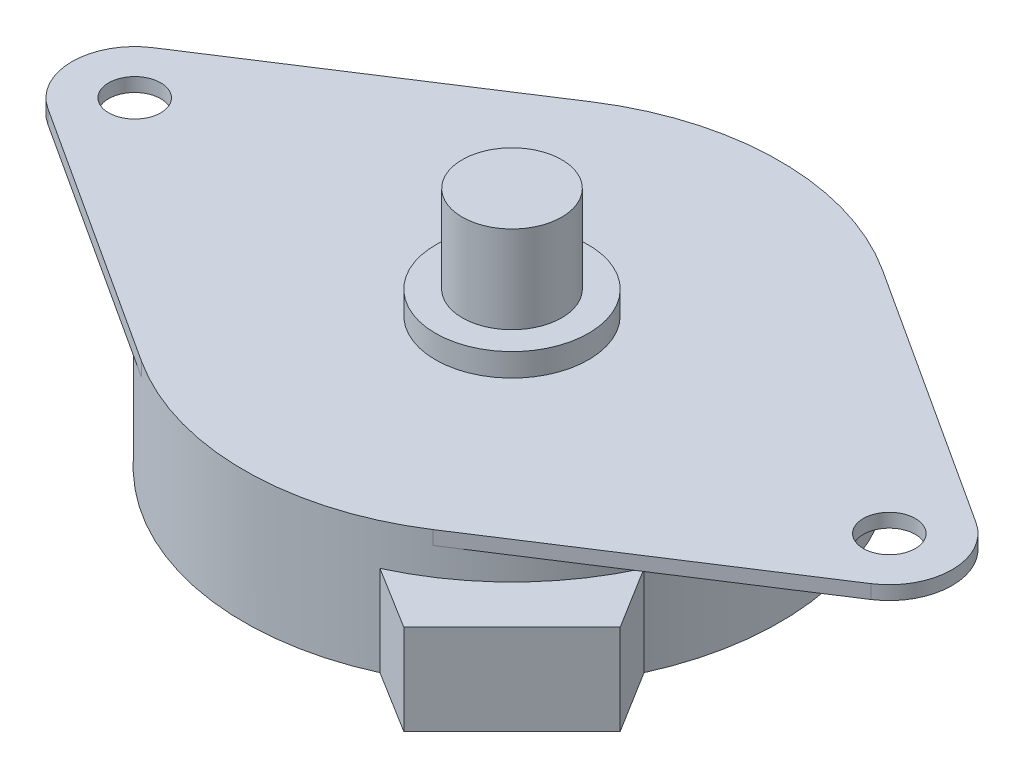
ISO-10303-21;
HEADER;
FILE_DESCRIPTION(('STEP AP214'),'2;1');
FILE_NAME('part.step','',(''),(''),'','','');
FILE_SCHEMA(('AUTOMOTIVE_DESIGN { 1 0 10303 214 1 1 1 1 }'));
ENDSEC;
DATA;
#1=APPLICATION_CONTEXT('core data for automotive mechanical design processes');
#2=APPLICATION_PROTOCOL_DEFINITION('international standard','automotive_design',2000,#1);
#3=PRODUCT_CONTEXT('',#1,'mechanical');
#4=PRODUCT('Part','Part','',(#3));
#5=PRODUCT_RELATED_PRODUCT_CATEGORY('part','',(#4));
#6=PRODUCT_DEFINITION_FORMATION('','',#4);
#7=PRODUCT_DEFINITION_CONTEXT('part definition',#1,'design');
#8=PRODUCT_DEFINITION('design','',#6,#7);
#9=PRODUCT_DEFINITION_SHAPE('','',#8);
#10=(LENGTH_UNIT() NAMED_UNIT(*) SI_UNIT(.MILLI.,.METRE.));
#11=(NAMED_UNIT(*) PLANE_ANGLE_UNIT() SI_UNIT($,.RADIAN.));
#12=(NAMED_UNIT(*) SI_UNIT($,.STERADIAN.) SOLID_ANGLE_UNIT());
#13=UNCERTAINTY_MEASURE_WITH_UNIT(LENGTH_MEASURE(1.E-05),#10,'distance_accuracy_value','');
#14=(GEOMETRIC_REPRESENTATION_CONTEXT(3) GLOBAL_UNCERTAINTY_ASSIGNED_CONTEXT((#13)) GLOBAL_UNIT_ASSIGNED_CONTEXT((#10,
#11,#12)) REPRESENTATION_CONTEXT('',''));
#15=CARTESIAN_POINT('',(0.,0.,0.));
#16=DIRECTION('',(0.,0.,1.));
#17=DIRECTION('',(1.,0.,0.));
#18=AXIS2_PLACEMENT_3D('',#15,#16,#17);
#19=CARTESIAN_POINT('',(0.,2.4,0.));
#20=DIRECTION('',(0.,1.,0.));
#21=DIRECTION('',(0.,0.,1.));
#22=AXIS2_PLACEMENT_3D('',#19,#20,#21);
#23=PLANE('',#22);
#24=CARTESIAN_POINT('',(0.,2.4,0.));
#25=DIRECTION('',(0.,1.,0.));
#26=DIRECTION('',(0.,0.,1.));
#27=AXIS2_PLACEMENT_3D('',#24,#25,#26);
#28=CIRCLE('',#27,5.);
#29=CARTESIAN_POINT('',(0.,2.4,5.));
#30=VERTEX_POINT('',#29);
#31=EDGE_CURVE('E171',#30,#30,#28,.T.);
#32=ORIENTED_EDGE('',*,*,#31,.T.);
#33=EDGE_LOOP('',(#32));
#34=FACE_BOUND('',#33,.T.);
#35=CARTESIAN_POINT('',(0.,2.4,0.));
#36=DIRECTION('',(0.,1.,0.));
#37=DIRECTION('',(0.,0.,1.));
#38=AXIS2_PLACEMENT_3D('',#35,#36,#37);
#39=CIRCLE('',#38,3.25);
#40=CARTESIAN_POINT('',(0.,2.4,3.25));
#41=VERTEX_POINT('',#40);
#42=EDGE_CURVE('E267',#41,#41,#39,.T.);
#43=ORIENTED_EDGE('',*,*,#42,.F.);
#44=EDGE_LOOP('',(#43));
#45=FACE_BOUND('',#44,.T.);
#46=ADVANCED_FACE('F31',(#34,#45),#23,.T.);
#47=CARTESIAN_POINT('',(-47.7910898419424,0.9,0.));
#48=DIRECTION('',(0.,1.,0.));
#49=DIRECTION('',(0.,0.,1.));
#50=AXIS2_PLACEMENT_3D('',#47,#48,#49);
#51=PLANE('',#50);
#52=CARTESIAN_POINT('',(24.65,0.9,0.));
#53=DIRECTION('',(0.,1.,0.));
#54=DIRECTION('',(0.,0.,1.));
#55=AXIS2_PLACEMENT_3D('',#52,#53,#54);
#56=CIRCLE('',#55,1.7);
#57=CARTESIAN_POINT('',(24.65,0.9,1.7));
#58=VERTEX_POINT('',#57);
#59=EDGE_CURVE('E136',#58,#58,#56,.F.);
#60=ORIENTED_EDGE('',*,*,#59,.T.);
#61=EDGE_LOOP('',(#60));
#62=FACE_BOUND('',#61,.T.);
#63=CARTESIAN_POINT('',(-24.65,0.9,0.));
#64=DIRECTION('',(0.,1.,0.));
#65=DIRECTION('',(0.,0.,1.));
#66=AXIS2_PLACEMENT_3D('',#63,#64,#65);
#67=CIRCLE('',#66,1.7);
#68=CARTESIAN_POINT('',(-24.65,0.9,1.7));
#69=VERTEX_POINT('',#68);
#70=EDGE_CURVE('E133',#69,#69,#67,.T.);
#71=ORIENTED_EDGE('',*,*,#70,.F.);
#72=EDGE_LOOP('',(#71));
#73=FACE_BOUND('',#72,.T.);
#74=DIRECTION('',(0.83933757956189,0.,-0.543610547667343));
#75=VECTOR('',#74,1.);
#76=CARTESIAN_POINT('',(-43.1814134523762,0.9,7.11736488554988));
#77=LINE('',#76,#75);
#78=CARTESIAN_POINT('',(-26.8788032454361,0.9,-3.44128407620375));
#79=VERTEX_POINT('',#78);
#80=CARTESIAN_POINT('',(-9.51318458417851,0.9,-14.6884076423331));
#81=VERTEX_POINT('',#80);
#82=EDGE_CURVE('E152',#79,#81,#77,.T.);
#83=ORIENTED_EDGE('',*,*,#82,.F.);
#84=CARTESIAN_POINT('',(-24.65,0.9,0.));
#85=DIRECTION('',(0.,1.,0.));
#86=DIRECTION('',(0.,0.,1.));
#87=AXIS2_PLACEMENT_3D('',#84,#85,#86);
#88=CIRCLE('',#87,4.1);
#89=CARTESIAN_POINT('',(-26.8788032454361,0.9,3.44128407620375));
#90=VERTEX_POINT('',#89);
#91=EDGE_CURVE('E174',#79,#90,#88,.T.);
#92=ORIENTED_EDGE('',*,*,#91,.T.);
#93=DIRECTION('',(0.83933757956189,0.,0.543610547667343));
#94=VECTOR('',#93,1.);
#95=CARTESIAN_POINT('',(-43.1814134523762,0.9,-7.11736488554987));
#96=LINE('',#95,#94);
#97=CARTESIAN_POINT('',(-9.51318458417851,0.9,14.6884076423331));
#98=VERTEX_POINT('',#97);
#99=EDGE_CURVE('E176',#90,#98,#96,.T.);
#100=ORIENTED_EDGE('',*,*,#99,.T.);
#101=CARTESIAN_POINT('',(0.,0.9,0.));
#102=DIRECTION('',(0.,1.,0.));
#103=DIRECTION('',(0.,0.,1.));
#104=AXIS2_PLACEMENT_3D('',#101,#102,#103);
#105=CIRCLE('',#104,17.5);
#106=CARTESIAN_POINT('',(9.51318458417851,0.9,14.6884076423331));
#107=VERTEX_POINT('',#106);
#108=EDGE_CURVE('E129',#98,#107,#105,.T.);
#109=ORIENTED_EDGE('',*,*,#108,.T.);
#110=DIRECTION('',(-0.83933757956189,0.,0.543610547667343));
#111=VECTOR('',#110,1.);
#112=CARTESIAN_POINT('',(-24.1550442840192,0.9,36.494180170216));
#113=LINE('',#112,#111);
#114=CARTESIAN_POINT('',(26.8788032454361,0.9,3.44128407620375));
#115=VERTEX_POINT('',#114);
#116=EDGE_CURVE('E127',#115,#107,#113,.T.);
#117=ORIENTED_EDGE('',*,*,#116,.F.);
#118=CARTESIAN_POINT('',(24.65,0.9,0.));
#119=DIRECTION('',(0.,1.,0.));
#120=DIRECTION('',(0.,0.,1.));
#121=AXIS2_PLACEMENT_3D('',#118,#119,#120);
#122=CIRCLE('',#121,4.1);
#123=CARTESIAN_POINT('',(26.8788032454361,0.9,-3.44128407620374));
#124=VERTEX_POINT('',#123);
#125=EDGE_CURVE('E109',#124,#115,#122,.F.);
#126=ORIENTED_EDGE('',*,*,#125,.F.);
#127=DIRECTION('',(-0.83933757956189,0.,-0.543610547667343));
#128=VECTOR('',#127,1.);
#129=CARTESIAN_POINT('',(-24.1550442840192,0.9,-36.494180170216));
#130=LINE('',#129,#128);
#131=CARTESIAN_POINT('',(9.51318458417851,0.9,-14.6884076423331));
#132=VERTEX_POINT('',#131);
#133=EDGE_CURVE('E119',#124,#132,#130,.T.);
#134=ORIENTED_EDGE('',*,*,#133,.T.);
#135=EDGE_CURVE('E55',#132,#81,#105,.T.);
#136=ORIENTED_EDGE('',*,*,#135,.T.);
#137=EDGE_LOOP('',(#83,#92,#100,#109,#117,#126,#134,#136));
#138=FACE_BOUND('',#137,.T.);
#139=CARTESIAN_POINT('',(0.,0.9,0.));
#140=DIRECTION('',(0.,1.,0.));
#141=DIRECTION('',(0.,0.,1.));
#142=AXIS2_PLACEMENT_3D('',#139,#140,#141);
#143=CIRCLE('',#142,5.);
#144=CARTESIAN_POINT('',(0.,0.9,5.));
#145=VERTEX_POINT('',#144);
#146=EDGE_CURVE('E281',#145,#145,#143,.T.);
#147=ORIENTED_EDGE('',*,*,#146,.F.);
#148=EDGE_LOOP('',(#147));
#149=FACE_BOUND('',#148,.T.);
#150=ADVANCED_FACE('F124',(#62,#73,#138,#149),#51,.T.);
#151=CARTESIAN_POINT('',(-47.7910898419424,0.,0.));
#152=DIRECTION('',(0.,1.,0.));
#153=DIRECTION('',(0.,0.,1.));
#154=AXIS2_PLACEMENT_3D('',#151,#152,#153);
#155=PLANE('',#154);
#156=CARTESIAN_POINT('',(24.65,0.,0.));
#157=DIRECTION('',(0.,1.,0.));
#158=DIRECTION('',(0.,0.,1.));
#159=AXIS2_PLACEMENT_3D('',#156,#157,#158);
#160=CIRCLE('',#159,1.7);
#161=CARTESIAN_POINT('',(24.65,0.,1.7));
#162=VERTEX_POINT('',#161);
#163=EDGE_CURVE('E150',#162,#162,#160,.F.);
#164=ORIENTED_EDGE('',*,*,#163,.F.);
#165=EDGE_LOOP('',(#164));
#166=FACE_BOUND('',#165,.T.);
#167=CARTESIAN_POINT('',(0.,0.,0.));
#168=DIRECTION('',(0.,-1.,0.));
#169=DIRECTION('',(0.,0.,-1.));
#170=AXIS2_PLACEMENT_3D('',#167,#168,#169);
#171=CIRCLE('',#170,17.5);
#172=CARTESIAN_POINT('',(9.51318458417851,0.,-14.6884076423331));
#173=VERTEX_POINT('',#172);
#174=CARTESIAN_POINT('',(9.51318458417851,0.,14.6884076423331));
#175=VERTEX_POINT('',#174);
#176=EDGE_CURVE('E166',#173,#175,#171,.T.);
#177=ORIENTED_EDGE('',*,*,#176,.F.);
#178=DIRECTION('',(-0.83933757956189,0.,-0.543610547667343));
#179=VECTOR('',#178,1.);
#180=CARTESIAN_POINT('',(-24.1550442840192,0.,-36.494180170216));
#181=LINE('',#180,#179);
#182=CARTESIAN_POINT('',(26.8788032454361,0.,-3.44128407620374));
#183=VERTEX_POINT('',#182);
#184=EDGE_CURVE('E145',#183,#173,#181,.T.);
#185=ORIENTED_EDGE('',*,*,#184,.F.);
#186=CARTESIAN_POINT('',(24.65,0.,0.));
#187=DIRECTION('',(0.,1.,0.));
#188=DIRECTION('',(0.,0.,1.));
#189=AXIS2_PLACEMENT_3D('',#186,#187,#188);
#190=CIRCLE('',#189,4.1);
#191=CARTESIAN_POINT('',(26.8788032454361,0.,3.44128407620375));
#192=VERTEX_POINT('',#191);
#193=EDGE_CURVE('E111',#183,#192,#190,.F.);
#194=ORIENTED_EDGE('',*,*,#193,.T.);
#195=DIRECTION('',(-0.83933757956189,0.,0.543610547667343));
#196=VECTOR('',#195,1.);
#197=CARTESIAN_POINT('',(-24.1550442840192,0.,36.494180170216));
#198=LINE('',#197,#196);
#199=EDGE_CURVE('E146',#192,#175,#198,.T.);
#200=ORIENTED_EDGE('',*,*,#199,.T.);
#201=EDGE_LOOP('',(#177,#185,#194,#200));
#202=FACE_BOUND('',#201,.T.);
#203=ADVANCED_FACE('F193',(#166,#202),#155,.F.);
#204=CARTESIAN_POINT('',(-24.65,0.,0.));
#205=DIRECTION('',(0.,1.,0.));
#206=DIRECTION('',(0.,0.,1.));
#207=AXIS2_PLACEMENT_3D('',#204,#205,#206);
#208=CIRCLE('',#207,1.7);
#209=CARTESIAN_POINT('',(-24.65,0.,1.7));
#210=VERTEX_POINT('',#209);
#211=EDGE_CURVE('E147',#210,#210,#208,.T.);
#212=ORIENTED_EDGE('',*,*,#211,.T.);
#213=EDGE_LOOP('',(#212));
#214=FACE_BOUND('',#213,.T.);
#215=CARTESIAN_POINT('',(-9.51318458417851,0.,14.6884076423331));
#216=VERTEX_POINT('',#215);
#217=CARTESIAN_POINT('',(-9.51318458417851,0.,-14.6884076423331));
#218=VERTEX_POINT('',#217);
#219=EDGE_CURVE('E39',#216,#218,#171,.T.);
#220=ORIENTED_EDGE('',*,*,#219,.F.);
#221=DIRECTION('',(0.83933757956189,0.,0.543610547667343));
#222=VECTOR('',#221,1.);
#223=CARTESIAN_POINT('',(-43.1814134523762,0.,-7.11736488554987));
#224=LINE('',#223,#222);
#225=CARTESIAN_POINT('',(-26.8788032454361,0.,3.44128407620375));
#226=VERTEX_POINT('',#225);
#227=EDGE_CURVE('E142',#226,#216,#224,.T.);
#228=ORIENTED_EDGE('',*,*,#227,.F.);
#229=CARTESIAN_POINT('',(-24.65,0.,0.));
#230=DIRECTION('',(0.,1.,0.));
#231=DIRECTION('',(0.,0.,1.));
#232=AXIS2_PLACEMENT_3D('',#229,#230,#231);
#233=CIRCLE('',#232,4.1);
#234=CARTESIAN_POINT('',(-26.8788032454361,0.,-3.44128407620375));
#235=VERTEX_POINT('',#234);
#236=EDGE_CURVE('E140',#235,#226,#233,.T.);
#237=ORIENTED_EDGE('',*,*,#236,.F.);
#238=DIRECTION('',(0.83933757956189,0.,-0.543610547667343));
#239=VECTOR('',#238,1.);
#240=CARTESIAN_POINT('',(-43.1814134523762,0.,7.11736488554988));
#241=LINE('',#240,#239);
#242=EDGE_CURVE('E143',#235,#218,#241,.T.);
#243=ORIENTED_EDGE('',*,*,#242,.T.);
#244=EDGE_LOOP('',(#220,#228,#237,#243));
#245=FACE_BOUND('',#244,.T.);
#246=ADVANCED_FACE('F220',(#214,#245),#155,.F.);
#247=CARTESIAN_POINT('',(-43.1814134523762,0.9,7.11736488554988));
#248=DIRECTION('',(-0.543610547667343,0.,-0.83933757956189));
#249=DIRECTION('',(-0.83933757956189,0.,0.543610547667343));
#250=AXIS2_PLACEMENT_3D('',#247,#248,#249);
#251=PLANE('',#250);
#252=ORIENTED_EDGE('',*,*,#242,.F.);
#253=DIRECTION('',(0.,-1.,0.));
#254=VECTOR('',#253,1.);
#255=CARTESIAN_POINT('',(-26.8788032454361,0.9,-3.44128407620375));
#256=LINE('',#255,#254);
#257=EDGE_CURVE('E86',#79,#235,#256,.T.);
#258=ORIENTED_EDGE('',*,*,#257,.F.);
#259=ORIENTED_EDGE('',*,*,#82,.T.);
#260=DIRECTION('',(0.,-1.,0.));
#261=VECTOR('',#260,1.);
#262=CARTESIAN_POINT('',(-9.51318458417851,0.9,-14.6884076423331));
#263=LINE('',#262,#261);
#264=EDGE_CURVE('E139',#81,#218,#263,.T.);
#265=ORIENTED_EDGE('',*,*,#264,.T.);
#266=EDGE_LOOP('',(#252,#258,#259,#265));
#267=FACE_BOUND('',#266,.T.);
#268=ADVANCED_FACE('F33',(#267),#251,.T.);
#269=CARTESIAN_POINT('',(-24.65,0.9,0.));
#270=DIRECTION('',(0.,-1.,0.));
#271=DIRECTION('',(0.,0.,-1.));
#272=AXIS2_PLACEMENT_3D('',#269,#270,#271);
#273=CYLINDRICAL_SURFACE('',#272,4.1);
#274=ORIENTED_EDGE('',*,*,#236,.T.);
#275=DIRECTION('',(0.,-1.,0.));
#276=VECTOR('',#275,1.);
#277=CARTESIAN_POINT('',(-26.8788032454361,0.9,3.44128407620375));
#278=LINE('',#277,#276);
#279=EDGE_CURVE('E156',#90,#226,#278,.T.);
#280=ORIENTED_EDGE('',*,*,#279,.F.);
#281=ORIENTED_EDGE('',*,*,#91,.F.);
#282=ORIENTED_EDGE('',*,*,#257,.T.);
#283=EDGE_LOOP('',(#274,#280,#281,#282));
#284=FACE_BOUND('',#283,.T.);
#285=ADVANCED_FACE('F322',(#284),#273,.T.);
#286=CARTESIAN_POINT('',(-43.1814134523762,0.9,-7.11736488554987));
#287=DIRECTION('',(0.543610547667343,0.,-0.83933757956189));
#288=DIRECTION('',(-0.83933757956189,0.,-0.543610547667343));
#289=AXIS2_PLACEMENT_3D('',#286,#287,#288);
#290=PLANE('',#289);
#291=ORIENTED_EDGE('',*,*,#227,.T.);
#292=DIRECTION('',(0.,-1.,0.));
#293=VECTOR('',#292,1.);
#294=CARTESIAN_POINT('',(-9.51318458417851,0.9,14.6884076423331));
#295=LINE('',#294,#293);
#296=EDGE_CURVE('E159',#98,#216,#295,.T.);
#297=ORIENTED_EDGE('',*,*,#296,.F.);
#298=ORIENTED_EDGE('',*,*,#99,.F.);
#299=ORIENTED_EDGE('',*,*,#279,.T.);
#300=EDGE_LOOP('',(#291,#297,#298,#299));
#301=FACE_BOUND('',#300,.T.);
#302=ADVANCED_FACE('F215',(#301),#290,.F.);
#303=CARTESIAN_POINT('',(-24.1550442840192,0.9,36.494180170216));
#304=DIRECTION('',(0.543610547667343,0.,0.83933757956189));
#305=DIRECTION('',(0.83933757956189,0.,-0.543610547667343));
#306=AXIS2_PLACEMENT_3D('',#303,#304,#305);
#307=PLANE('',#306);
#308=ORIENTED_EDGE('',*,*,#199,.F.);
#309=DIRECTION('',(0.,-1.,0.));
#310=VECTOR('',#309,1.);
#311=CARTESIAN_POINT('',(26.8788032454361,0.9,3.44128407620375));
#312=LINE('',#311,#310);
#313=EDGE_CURVE('E115',#115,#192,#312,.T.);
#314=ORIENTED_EDGE('',*,*,#313,.F.);
#315=ORIENTED_EDGE('',*,*,#116,.T.);
#316=DIRECTION('',(0.,-1.,0.));
#317=VECTOR('',#316,1.);
#318=CARTESIAN_POINT('',(9.51318458417851,0.9,14.6884076423331));
#319=LINE('',#318,#317);
#320=EDGE_CURVE('E155',#107,#175,#319,.T.);
#321=ORIENTED_EDGE('',*,*,#320,.T.);
#322=EDGE_LOOP('',(#308,#314,#315,#321));
#323=FACE_BOUND('',#322,.T.);
#324=ADVANCED_FACE('F190',(#323),#307,.T.);
#325=CARTESIAN_POINT('',(24.65,0.9,0.));
#326=DIRECTION('',(0.,-1.,0.));
#327=DIRECTION('',(0.,0.,-1.));
#328=AXIS2_PLACEMENT_3D('',#325,#326,#327);
#329=CYLINDRICAL_SURFACE('',#328,4.1);
#330=ORIENTED_EDGE('',*,*,#193,.F.);
#331=DIRECTION('',(0.,-1.,0.));
#332=VECTOR('',#331,1.);
#333=CARTESIAN_POINT('',(26.8788032454361,0.9,-3.44128407620374));
#334=LINE('',#333,#332);
#335=EDGE_CURVE('E105',#124,#183,#334,.T.);
#336=ORIENTED_EDGE('',*,*,#335,.F.);
#337=ORIENTED_EDGE('',*,*,#125,.T.);
#338=ORIENTED_EDGE('',*,*,#313,.T.);
#339=EDGE_LOOP('',(#330,#336,#337,#338));
#340=FACE_BOUND('',#339,.T.);
#341=ADVANCED_FACE('F107',(#340),#329,.T.);
#342=CARTESIAN_POINT('',(-24.1550442840192,0.9,-36.494180170216));
#343=DIRECTION('',(-0.543610547667343,0.,0.83933757956189));
#344=DIRECTION('',(0.83933757956189,0.,0.543610547667343));
#345=AXIS2_PLACEMENT_3D('',#342,#343,#344);
#346=PLANE('',#345);
#347=ORIENTED_EDGE('',*,*,#184,.T.);
#348=DIRECTION('',(0.,-1.,0.));
#349=VECTOR('',#348,1.);
#350=CARTESIAN_POINT('',(9.51318458417851,0.9,-14.6884076423331));
#351=LINE('',#350,#349);
#352=EDGE_CURVE('E116',#132,#173,#351,.T.);
#353=ORIENTED_EDGE('',*,*,#352,.F.);
#354=ORIENTED_EDGE('',*,*,#133,.F.);
#355=ORIENTED_EDGE('',*,*,#335,.T.);
#356=EDGE_LOOP('',(#347,#353,#354,#355));
#357=FACE_BOUND('',#356,.T.);
#358=ADVANCED_FACE('F120',(#357),#346,.F.);
#359=CARTESIAN_POINT('',(-24.65,0.9,0.));
#360=DIRECTION('',(0.,-1.,0.));
#361=DIRECTION('',(0.,0.,-1.));
#362=AXIS2_PLACEMENT_3D('',#359,#360,#361);
#363=CYLINDRICAL_SURFACE('',#362,1.7);
#364=ORIENTED_EDGE('',*,*,#70,.T.);
#365=EDGE_LOOP('',(#364));
#366=FACE_BOUND('',#365,.T.);
#367=ORIENTED_EDGE('',*,*,#211,.F.);
#368=EDGE_LOOP('',(#367));
#369=FACE_BOUND('',#368,.T.);
#370=ADVANCED_FACE('F309',(#366,#369),#363,.F.);
#371=CARTESIAN_POINT('',(0.,0.9,0.));
#372=DIRECTION('',(0.,-1.,0.));
#373=DIRECTION('',(0.,0.,-1.));
#374=AXIS2_PLACEMENT_3D('',#371,#372,#373);
#375=CYLINDRICAL_SURFACE('',#374,17.5);
#376=ORIENTED_EDGE('',*,*,#352,.T.);
#377=ORIENTED_EDGE('',*,*,#176,.T.);
#378=ORIENTED_EDGE('',*,*,#320,.F.);
#379=ORIENTED_EDGE('',*,*,#108,.F.);
#380=ORIENTED_EDGE('',*,*,#296,.T.);
#381=ORIENTED_EDGE('',*,*,#219,.T.);
#382=ORIENTED_EDGE('',*,*,#264,.F.);
#383=ORIENTED_EDGE('',*,*,#135,.F.);
#384=EDGE_LOOP('',(#376,#377,#378,#379,#380,#381,#382,#383));
#385=FACE_BOUND('',#384,.T.);
#386=CARTESIAN_POINT('',(0.,-1.8,0.));
#387=DIRECTION('',(0.,-1.,0.));
#388=DIRECTION('',(0.,0.,-1.));
#389=AXIS2_PLACEMENT_3D('',#386,#387,#388);
#390=CIRCLE('',#389,17.5);
#391=CARTESIAN_POINT('',(15.9116270991563,-1.8,7.28492436868048));
#392=VERTEX_POINT('',#391);
#393=CARTESIAN_POINT('',(7.28492436868042,-1.8,15.9116270991563));
#394=VERTEX_POINT('',#393);
#395=EDGE_CURVE('E11',#392,#394,#390,.T.);
#396=ORIENTED_EDGE('',*,*,#395,.F.);
#397=DIRECTION('',(0.,-1.,0.));
#398=VECTOR('',#397,1.);
#399=CARTESIAN_POINT('',(15.9116270991563,-1.8,7.28492436868048));
#400=LINE('',#399,#398);
#401=CARTESIAN_POINT('',(15.9116270991563,-7.7,7.28492436868048));
#402=VERTEX_POINT('',#401);
#403=EDGE_CURVE('E262',#392,#402,#400,.T.);
#404=ORIENTED_EDGE('',*,*,#403,.T.);
#405=CARTESIAN_POINT('',(0.,-7.7,0.));
#406=DIRECTION('',(0.,-1.,0.));
#407=DIRECTION('',(0.,0.,-1.));
#408=AXIS2_PLACEMENT_3D('',#405,#406,#407);
#409=CIRCLE('',#408,17.5);
#410=CARTESIAN_POINT('',(7.28492436868042,-7.7,15.9116270991563));
#411=VERTEX_POINT('',#410);
#412=EDGE_CURVE('E170',#411,#402,#409,.T.);
#413=ORIENTED_EDGE('',*,*,#412,.F.);
#414=DIRECTION('',(0.,-1.,0.));
#415=VECTOR('',#414,1.);
#416=CARTESIAN_POINT('',(7.28492436868042,-1.8,15.9116270991563));
#417=LINE('',#416,#415);
#418=EDGE_CURVE('E268',#394,#411,#417,.T.);
#419=ORIENTED_EDGE('',*,*,#418,.F.);
#420=EDGE_LOOP('',(#396,#404,#413,#419));
#421=FACE_BOUND('',#420,.T.);
#422=ADVANCED_FACE('F182',(#385,#421),#375,.T.);
#423=CARTESIAN_POINT('',(24.65,0.9,0.));
#424=DIRECTION('',(0.,-1.,0.));
#425=DIRECTION('',(0.,0.,-1.));
#426=AXIS2_PLACEMENT_3D('',#423,#424,#425);
#427=CYLINDRICAL_SURFACE('',#426,1.7);
#428=ORIENTED_EDGE('',*,*,#59,.F.);
#429=EDGE_LOOP('',(#428));
#430=FACE_BOUND('',#429,.T.);
#431=ORIENTED_EDGE('',*,*,#163,.T.);
#432=EDGE_LOOP('',(#431));
#433=FACE_BOUND('',#432,.T.);
#434=ADVANCED_FACE('F305',(#430,#433),#427,.F.);
#435=CARTESIAN_POINT('',(0.,-7.7,0.));
#436=DIRECTION('',(0.,-1.,0.));
#437=DIRECTION('',(0.,0.,-1.));
#438=AXIS2_PLACEMENT_3D('',#435,#436,#437);
#439=PLANE('',#438);
#440=ORIENTED_EDGE('',*,*,#412,.T.);
#441=DIRECTION('',(-0.527362861778142,0.,-0.84964016619812));
#442=VECTOR('',#441,1.);
#443=CARTESIAN_POINT('',(18.4572115114279,-7.7,11.3861436995624));
#444=LINE('',#443,#442);
#445=CARTESIAN_POINT('',(18.4572115114279,-7.7,11.3861436995624));
#446=VERTEX_POINT('',#445);
#447=EDGE_CURVE('E265',#446,#402,#444,.T.);
#448=ORIENTED_EDGE('',*,*,#447,.F.);
#449=DIRECTION('',(0.707106781186548,0.,-0.707106781186547));
#450=VECTOR('',#449,1.);
#451=CARTESIAN_POINT('',(11.3861436995624,-7.7,18.4572115114279));
#452=LINE('',#451,#450);
#453=CARTESIAN_POINT('',(11.3861436995624,-7.7,18.4572115114279));
#454=VERTEX_POINT('',#453);
#455=EDGE_CURVE('E259',#454,#446,#452,.T.);
#456=ORIENTED_EDGE('',*,*,#455,.F.);
#457=DIRECTION('',(-0.849640166198119,0.,-0.527362861778143));
#458=VECTOR('',#457,1.);
#459=CARTESIAN_POINT('',(11.3861436995624,-7.7,18.4572115114279));
#460=LINE('',#459,#458);
#461=EDGE_CURVE('E46',#454,#411,#460,.T.);
#462=ORIENTED_EDGE('',*,*,#461,.T.);
#463=EDGE_LOOP('',(#440,#448,#456,#462));
#464=FACE_BOUND('',#463,.T.);
#465=ADVANCED_FACE('F302',(#464),#439,.T.);
#466=CARTESIAN_POINT('',(0.,2.4,0.));
#467=DIRECTION('',(0.,-1.,0.));
#468=DIRECTION('',(0.,0.,-1.));
#469=AXIS2_PLACEMENT_3D('',#466,#467,#468);
#470=CYLINDRICAL_SURFACE('',#469,5.);
#471=ORIENTED_EDGE('',*,*,#31,.F.);
#472=EDGE_LOOP('',(#471));
#473=FACE_BOUND('',#472,.T.);
#474=ORIENTED_EDGE('',*,*,#146,.T.);
#475=EDGE_LOOP('',(#474));
#476=FACE_BOUND('',#475,.T.);
#477=ADVANCED_FACE('F288',(#473,#476),#470,.T.);
#478=CARTESIAN_POINT('',(0.,8.1,0.));
#479=DIRECTION('',(0.,-1.,0.));
#480=DIRECTION('',(0.,0.,-1.));
#481=AXIS2_PLACEMENT_3D('',#478,#479,#480);
#482=CYLINDRICAL_SURFACE('',#481,3.25);
#483=CARTESIAN_POINT('',(0.,8.1,0.));
#484=DIRECTION('',(0.,1.,0.));
#485=DIRECTION('',(0.,0.,1.));
#486=AXIS2_PLACEMENT_3D('',#483,#484,#485);
#487=CIRCLE('',#486,3.25);
#488=CARTESIAN_POINT('',(0.,8.1,3.25));
#489=VERTEX_POINT('',#488);
#490=EDGE_CURVE('E278',#489,#489,#487,.T.);
#491=ORIENTED_EDGE('',*,*,#490,.F.);
#492=EDGE_LOOP('',(#491));
#493=FACE_BOUND('',#492,.T.);
#494=ORIENTED_EDGE('',*,*,#42,.T.);
#495=EDGE_LOOP('',(#494));
#496=FACE_BOUND('',#495,.T.);
#497=ADVANCED_FACE('F401',(#493,#496),#482,.T.);
#498=CARTESIAN_POINT('',(0.,8.1,0.));
#499=DIRECTION('',(0.,1.,0.));
#500=DIRECTION('',(0.,0.,1.));
#501=AXIS2_PLACEMENT_3D('',#498,#499,#500);
#502=PLANE('',#501);
#503=ORIENTED_EDGE('',*,*,#490,.T.);
#504=EDGE_LOOP('',(#503));
#505=FACE_BOUND('',#504,.T.);
#506=ADVANCED_FACE('F416',(#505),#502,.T.);
#507=CARTESIAN_POINT('',(15.9116270991563,-1.8,7.28492436868048));
#508=DIRECTION('',(0.,-1.,0.));
#509=DIRECTION('',(1.,0.,0.));
#510=AXIS2_PLACEMENT_3D('',#507,#508,#509);
#511=PLANE('',#510);
#512=DIRECTION('',(-0.527362861778142,0.,-0.84964016619812));
#513=VECTOR('',#512,1.);
#514=CARTESIAN_POINT('',(18.4572115114279,-1.8,11.3861436995624));
#515=LINE('',#514,#513);
#516=CARTESIAN_POINT('',(18.4572115114279,-1.8,11.3861436995624));
#517=VERTEX_POINT('',#516);
#518=EDGE_CURVE('E247',#517,#392,#515,.T.);
#519=ORIENTED_EDGE('',*,*,#518,.T.);
#520=ORIENTED_EDGE('',*,*,#395,.T.);
#521=DIRECTION('',(-0.849640166198119,0.,-0.527362861778143));
#522=VECTOR('',#521,1.);
#523=CARTESIAN_POINT('',(11.3861436995624,-1.8,18.4572115114279));
#524=LINE('',#523,#522);
#525=CARTESIAN_POINT('',(11.3861436995624,-1.8,18.4572115114279));
#526=VERTEX_POINT('',#525);
#527=EDGE_CURVE('E258',#526,#394,#524,.T.);
#528=ORIENTED_EDGE('',*,*,#527,.F.);
#529=DIRECTION('',(0.707106781186548,0.,-0.707106781186547));
#530=VECTOR('',#529,1.);
#531=CARTESIAN_POINT('',(11.3861436995624,-1.8,18.4572115114279));
#532=LINE('',#531,#530);
#533=EDGE_CURVE('E254',#526,#517,#532,.T.);
#534=ORIENTED_EDGE('',*,*,#533,.T.);
#535=EDGE_LOOP('',(#519,#520,#528,#534));
#536=FACE_BOUND('',#535,.T.);
#537=ADVANCED_FACE('F249',(#536),#511,.F.);
#538=CARTESIAN_POINT('',(18.4572115114279,-1.8,11.3861436995624));
#539=DIRECTION('',(-0.84964016619812,0.,0.527362861778141));
#540=DIRECTION('',(0.527362861778142,0.,0.84964016619812));
#541=AXIS2_PLACEMENT_3D('',#538,#539,#540);
#542=PLANE('',#541);
#543=ORIENTED_EDGE('',*,*,#447,.T.);
#544=ORIENTED_EDGE('',*,*,#403,.F.);
#545=ORIENTED_EDGE('',*,*,#518,.F.);
#546=DIRECTION('',(0.,-1.,0.));
#547=VECTOR('',#546,1.);
#548=CARTESIAN_POINT('',(18.4572115114279,-1.8,11.3861436995624));
#549=LINE('',#548,#547);
#550=EDGE_CURVE('E274',#517,#446,#549,.T.);
#551=ORIENTED_EDGE('',*,*,#550,.T.);
#552=EDGE_LOOP('',(#543,#544,#545,#551));
#553=FACE_BOUND('',#552,.T.);
#554=ADVANCED_FACE('F263',(#553),#542,.F.);
#555=CARTESIAN_POINT('',(11.3861436995624,-1.8,18.4572115114279));
#556=DIRECTION('',(-0.527362861778144,0.,0.849640166198119));
#557=DIRECTION('',(0.849640166198119,0.,0.527362861778143));
#558=AXIS2_PLACEMENT_3D('',#555,#556,#557);
#559=PLANE('',#558);
#560=ORIENTED_EDGE('',*,*,#461,.F.);
#561=DIRECTION('',(0.,-1.,0.));
#562=VECTOR('',#561,1.);
#563=CARTESIAN_POINT('',(11.3861436995624,-1.8,18.4572115114279));
#564=LINE('',#563,#562);
#565=EDGE_CURVE('E272',#526,#454,#564,.T.);
#566=ORIENTED_EDGE('',*,*,#565,.F.);
#567=ORIENTED_EDGE('',*,*,#527,.T.);
#568=ORIENTED_EDGE('',*,*,#418,.T.);
#569=EDGE_LOOP('',(#560,#566,#567,#568));
#570=FACE_BOUND('',#569,.T.);
#571=ADVANCED_FACE('F456',(#570),#559,.T.);
#572=CARTESIAN_POINT('',(11.3861436995624,-1.8,18.4572115114279));
#573=DIRECTION('',(-0.707106781186547,0.,-0.707106781186548));
#574=DIRECTION('',(-0.707106781186548,0.,0.707106781186547));
#575=AXIS2_PLACEMENT_3D('',#572,#573,#574);
#576=PLANE('',#575);
#577=ORIENTED_EDGE('',*,*,#455,.T.);
#578=ORIENTED_EDGE('',*,*,#550,.F.);
#579=ORIENTED_EDGE('',*,*,#533,.F.);
#580=ORIENTED_EDGE('',*,*,#565,.T.);
#581=EDGE_LOOP('',(#577,#578,#579,#580));
#582=FACE_BOUND('',#581,.T.);
#583=ADVANCED_FACE('F465',(#582),#576,.F.);
#584=CLOSED_SHELL('',(#46,#150,#203,#246,#268,#285,#302,#324,#341,#358,#370,#422,#434,#465,#477,
#497,#506,#537,#554,#571,#583));
#585=MANIFOLD_SOLID_BREP('B2',#584);
#586=ADVANCED_BREP_SHAPE_REPRESENTATION('',(#18,#585),#14);
#587=SHAPE_DEFINITION_REPRESENTATION(#9,#586);
ENDSEC;
END-ISO-10303-21;
